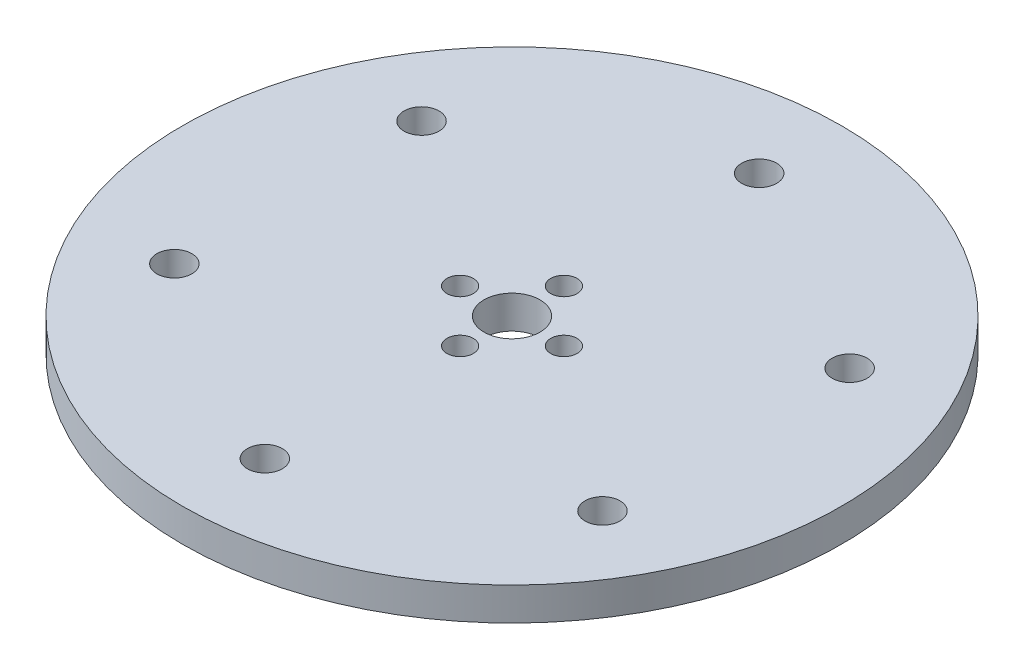
ISO-10303-21;
HEADER;
FILE_DESCRIPTION(('STEP AP214'),'2;1');
FILE_NAME('part.step','',(''),(''),'','','');
FILE_SCHEMA(('AUTOMOTIVE_DESIGN { 1 0 10303 214 1 1 1 1 }'));
ENDSEC;
DATA;
#1=APPLICATION_CONTEXT('core data for automotive mechanical design processes');
#2=APPLICATION_PROTOCOL_DEFINITION('international standard','automotive_design',2000,#1);
#3=PRODUCT_CONTEXT('',#1,'mechanical');
#4=PRODUCT('Part','Part','',(#3));
#5=PRODUCT_RELATED_PRODUCT_CATEGORY('part','',(#4));
#6=PRODUCT_DEFINITION_FORMATION('','',#4);
#7=PRODUCT_DEFINITION_CONTEXT('part definition',#1,'design');
#8=PRODUCT_DEFINITION('design','',#6,#7);
#9=PRODUCT_DEFINITION_SHAPE('','',#8);
#10=(LENGTH_UNIT() NAMED_UNIT(*) SI_UNIT(.MILLI.,.METRE.));
#11=(NAMED_UNIT(*) PLANE_ANGLE_UNIT() SI_UNIT($,.RADIAN.));
#12=(NAMED_UNIT(*) SI_UNIT($,.STERADIAN.) SOLID_ANGLE_UNIT());
#13=UNCERTAINTY_MEASURE_WITH_UNIT(LENGTH_MEASURE(1.E-05),#10,'distance_accuracy_value','');
#14=(GEOMETRIC_REPRESENTATION_CONTEXT(3) GLOBAL_UNCERTAINTY_ASSIGNED_CONTEXT((#13)) GLOBAL_UNIT_ASSIGNED_CONTEXT((#10,
#11,#12)) REPRESENTATION_CONTEXT('',''));
#15=CARTESIAN_POINT('',(0.,0.,0.));
#16=DIRECTION('',(0.,0.,1.));
#17=DIRECTION('',(1.,0.,0.));
#18=AXIS2_PLACEMENT_3D('',#15,#16,#17);
#19=CARTESIAN_POINT('',(0.,5.08,0.));
#20=DIRECTION('',(0.,-1.,0.));
#21=DIRECTION('',(0.,0.,-1.));
#22=AXIS2_PLACEMENT_3D('',#19,#20,#21);
#23=CYLINDRICAL_SURFACE('',#22,50.8);
#24=CARTESIAN_POINT('',(0.,5.08,0.));
#25=DIRECTION('',(0.,1.,0.));
#26=DIRECTION('',(0.,0.,1.));
#27=AXIS2_PLACEMENT_3D('',#24,#25,#26);
#28=CIRCLE('',#27,50.8);
#29=CARTESIAN_POINT('',(0.,5.08,50.8));
#30=VERTEX_POINT('',#29);
#31=EDGE_CURVE('E10',#30,#30,#28,.T.);
#32=ORIENTED_EDGE('',*,*,#31,.F.);
#33=EDGE_LOOP('',(#32));
#34=FACE_BOUND('',#33,.T.);
#35=CARTESIAN_POINT('',(0.,0.,0.));
#36=DIRECTION('',(0.,1.,0.));
#37=DIRECTION('',(0.,0.,1.));
#38=AXIS2_PLACEMENT_3D('',#35,#36,#37);
#39=CIRCLE('',#38,50.8);
#40=CARTESIAN_POINT('',(0.,0.,50.8));
#41=VERTEX_POINT('',#40);
#42=EDGE_CURVE('E38',#41,#41,#39,.T.);
#43=ORIENTED_EDGE('',*,*,#42,.T.);
#44=EDGE_LOOP('',(#43));
#45=FACE_BOUND('',#44,.T.);
#46=ADVANCED_FACE('F35',(#34,#45),#23,.T.);
#47=CARTESIAN_POINT('',(0.,5.08,0.));
#48=DIRECTION('',(0.,1.,0.));
#49=DIRECTION('',(0.,0.,1.));
#50=AXIS2_PLACEMENT_3D('',#47,#48,#49);
#51=PLANE('',#50);
#52=CARTESIAN_POINT('',(8.001,5.08,0.));
#53=DIRECTION('',(0.,-1.,0.));
#54=DIRECTION('',(0.,0.,-1.));
#55=AXIS2_PLACEMENT_3D('',#52,#53,#54);
#56=CIRCLE('',#55,2.032);
#57=CARTESIAN_POINT('',(8.001,5.08,-2.03200000000008));
#58=VERTEX_POINT('',#57);
#59=EDGE_CURVE('E104',#58,#58,#56,.T.);
#60=ORIENTED_EDGE('',*,*,#59,.T.);
#61=EDGE_LOOP('',(#60));
#62=FACE_BOUND('',#61,.T.);
#63=CARTESIAN_POINT('',(0.,5.08,8.001));
#64=DIRECTION('',(0.,-1.,0.));
#65=DIRECTION('',(0.,0.,-1.));
#66=AXIS2_PLACEMENT_3D('',#63,#64,#65);
#67=CIRCLE('',#66,2.032);
#68=CARTESIAN_POINT('',(0.,5.08,5.969));
#69=VERTEX_POINT('',#68);
#70=EDGE_CURVE('E98',#69,#69,#67,.T.);
#71=ORIENTED_EDGE('',*,*,#70,.T.);
#72=EDGE_LOOP('',(#71));
#73=FACE_BOUND('',#72,.T.);
#74=CARTESIAN_POINT('',(-8.001,5.08,0.));
#75=DIRECTION('',(0.,-1.,0.));
#76=DIRECTION('',(0.,0.,-1.));
#77=AXIS2_PLACEMENT_3D('',#74,#75,#76);
#78=CIRCLE('',#77,2.032);
#79=CARTESIAN_POINT('',(-8.001,5.08,-2.03199999999997));
#80=VERTEX_POINT('',#79);
#81=EDGE_CURVE('E92',#80,#80,#78,.T.);
#82=ORIENTED_EDGE('',*,*,#81,.T.);
#83=EDGE_LOOP('',(#82));
#84=FACE_BOUND('',#83,.T.);
#85=CARTESIAN_POINT('',(0.,5.08,-8.001));
#86=DIRECTION('',(0.,-1.,0.));
#87=DIRECTION('',(0.,0.,-1.));
#88=AXIS2_PLACEMENT_3D('',#85,#86,#87);
#89=CIRCLE('',#88,2.032);
#90=CARTESIAN_POINT('',(0.,5.08,-10.033));
#91=VERTEX_POINT('',#90);
#92=EDGE_CURVE('E86',#91,#91,#89,.T.);
#93=ORIENTED_EDGE('',*,*,#92,.T.);
#94=EDGE_LOOP('',(#93));
#95=FACE_BOUND('',#94,.T.);
#96=CARTESIAN_POINT('',(0.,5.08,0.));
#97=DIRECTION('',(0.,-1.,0.));
#98=DIRECTION('',(0.,0.,-1.));
#99=AXIS2_PLACEMENT_3D('',#96,#97,#98);
#100=CIRCLE('',#99,4.318);
#101=CARTESIAN_POINT('',(0.,5.08,-4.318));
#102=VERTEX_POINT('',#101);
#103=EDGE_CURVE('E80',#102,#102,#100,.T.);
#104=ORIENTED_EDGE('',*,*,#103,.T.);
#105=EDGE_LOOP('',(#104));
#106=FACE_BOUND('',#105,.T.);
#107=CARTESIAN_POINT('',(32.9955678841869,5.08,19.0500000000004));
#108=DIRECTION('',(0.,1.,0.));
#109=DIRECTION('',(0.,0.,1.));
#110=AXIS2_PLACEMENT_3D('',#107,#108,#109);
#111=CIRCLE('',#110,2.69875);
#112=CARTESIAN_POINT('',(32.9955678841869,5.08,21.7487500000004));
#113=VERTEX_POINT('',#112);
#114=EDGE_CURVE('E77',#113,#113,#111,.T.);
#115=ORIENTED_EDGE('',*,*,#114,.F.);
#116=EDGE_LOOP('',(#115));
#117=FACE_BOUND('',#116,.T.);
#118=CARTESIAN_POINT('',(32.9955678841873,5.08,-19.0499999999997));
#119=DIRECTION('',(0.,1.,0.));
#120=DIRECTION('',(0.,0.,1.));
#121=AXIS2_PLACEMENT_3D('',#118,#119,#120);
#122=CIRCLE('',#121,2.69875);
#123=CARTESIAN_POINT('',(32.9955678841873,5.08,-16.3512499999997));
#124=VERTEX_POINT('',#123);
#125=EDGE_CURVE('E71',#124,#124,#122,.T.);
#126=ORIENTED_EDGE('',*,*,#125,.F.);
#127=EDGE_LOOP('',(#126));
#128=FACE_BOUND('',#127,.T.);
#129=CARTESIAN_POINT('',(2.66050878019847E-13,5.08,-38.1));
#130=DIRECTION('',(0.,1.,0.));
#131=DIRECTION('',(0.,0.,1.));
#132=AXIS2_PLACEMENT_3D('',#129,#130,#131);
#133=CIRCLE('',#132,2.69875);
#134=CARTESIAN_POINT('',(2.66050878019847E-13,5.08,-35.40125));
#135=VERTEX_POINT('',#134);
#136=EDGE_CURVE('E65',#135,#135,#133,.T.);
#137=ORIENTED_EDGE('',*,*,#136,.F.);
#138=EDGE_LOOP('',(#137));
#139=FACE_BOUND('',#138,.T.);
#140=CARTESIAN_POINT('',(-32.995567884187,5.08,-19.0500000000002));
#141=DIRECTION('',(0.,1.,0.));
#142=DIRECTION('',(0.,0.,1.));
#143=AXIS2_PLACEMENT_3D('',#140,#141,#142);
#144=CIRCLE('',#143,2.69875);
#145=CARTESIAN_POINT('',(-32.995567884187,5.08,-16.3512500000002));
#146=VERTEX_POINT('',#145);
#147=EDGE_CURVE('E59',#146,#146,#144,.T.);
#148=ORIENTED_EDGE('',*,*,#147,.F.);
#149=EDGE_LOOP('',(#148));
#150=FACE_BOUND('',#149,.T.);
#151=CARTESIAN_POINT('',(-32.9955678841872,5.08,19.0499999999999));
#152=DIRECTION('',(0.,1.,0.));
#153=DIRECTION('',(0.,0.,1.));
#154=AXIS2_PLACEMENT_3D('',#151,#152,#153);
#155=CIRCLE('',#154,2.69875);
#156=CARTESIAN_POINT('',(-32.9955678841872,5.08,21.7487499999999));
#157=VERTEX_POINT('',#156);
#158=EDGE_CURVE('E53',#157,#157,#155,.T.);
#159=ORIENTED_EDGE('',*,*,#158,.F.);
#160=EDGE_LOOP('',(#159));
#161=FACE_BOUND('',#160,.T.);
#162=CARTESIAN_POINT('',(0.,5.08,38.1));
#163=DIRECTION('',(0.,1.,0.));
#164=DIRECTION('',(0.,0.,1.));
#165=AXIS2_PLACEMENT_3D('',#162,#163,#164);
#166=CIRCLE('',#165,2.69875);
#167=CARTESIAN_POINT('',(0.,5.08,40.79875));
#168=VERTEX_POINT('',#167);
#169=EDGE_CURVE('E47',#168,#168,#166,.T.);
#170=ORIENTED_EDGE('',*,*,#169,.F.);
#171=EDGE_LOOP('',(#170));
#172=FACE_BOUND('',#171,.T.);
#173=ORIENTED_EDGE('',*,*,#31,.T.);
#174=EDGE_LOOP('',(#173));
#175=FACE_BOUND('',#174,.T.);
#176=ADVANCED_FACE('F113',(#62,#73,#84,#95,#106,#117,#128,#139,#150,#161,#172,#175),#51,.T.);
#177=CARTESIAN_POINT('',(0.,0.,0.));
#178=DIRECTION('',(0.,1.,0.));
#179=DIRECTION('',(0.,0.,1.));
#180=AXIS2_PLACEMENT_3D('',#177,#178,#179);
#181=PLANE('',#180);
#182=CARTESIAN_POINT('',(8.001,0.,0.));
#183=DIRECTION('',(0.,-1.,0.));
#184=DIRECTION('',(0.,0.,-1.));
#185=AXIS2_PLACEMENT_3D('',#182,#183,#184);
#186=CIRCLE('',#185,2.032);
#187=CARTESIAN_POINT('',(8.001,0.,-2.03200000000008));
#188=VERTEX_POINT('',#187);
#189=EDGE_CURVE('E107',#188,#188,#186,.T.);
#190=ORIENTED_EDGE('',*,*,#189,.F.);
#191=EDGE_LOOP('',(#190));
#192=FACE_BOUND('',#191,.T.);
#193=CARTESIAN_POINT('',(0.,0.,8.001));
#194=DIRECTION('',(0.,-1.,0.));
#195=DIRECTION('',(0.,0.,-1.));
#196=AXIS2_PLACEMENT_3D('',#193,#194,#195);
#197=CIRCLE('',#196,2.032);
#198=CARTESIAN_POINT('',(0.,0.,5.969));
#199=VERTEX_POINT('',#198);
#200=EDGE_CURVE('E101',#199,#199,#197,.T.);
#201=ORIENTED_EDGE('',*,*,#200,.F.);
#202=EDGE_LOOP('',(#201));
#203=FACE_BOUND('',#202,.T.);
#204=CARTESIAN_POINT('',(-8.001,0.,0.));
#205=DIRECTION('',(0.,-1.,0.));
#206=DIRECTION('',(0.,0.,-1.));
#207=AXIS2_PLACEMENT_3D('',#204,#205,#206);
#208=CIRCLE('',#207,2.032);
#209=CARTESIAN_POINT('',(-8.001,0.,-2.03199999999997));
#210=VERTEX_POINT('',#209);
#211=EDGE_CURVE('E95',#210,#210,#208,.T.);
#212=ORIENTED_EDGE('',*,*,#211,.F.);
#213=EDGE_LOOP('',(#212));
#214=FACE_BOUND('',#213,.T.);
#215=CARTESIAN_POINT('',(0.,0.,-8.001));
#216=DIRECTION('',(0.,-1.,0.));
#217=DIRECTION('',(0.,0.,-1.));
#218=AXIS2_PLACEMENT_3D('',#215,#216,#217);
#219=CIRCLE('',#218,2.032);
#220=CARTESIAN_POINT('',(0.,0.,-10.033));
#221=VERTEX_POINT('',#220);
#222=EDGE_CURVE('E89',#221,#221,#219,.T.);
#223=ORIENTED_EDGE('',*,*,#222,.F.);
#224=EDGE_LOOP('',(#223));
#225=FACE_BOUND('',#224,.T.);
#226=CARTESIAN_POINT('',(0.,0.,0.));
#227=DIRECTION('',(0.,-1.,0.));
#228=DIRECTION('',(0.,0.,-1.));
#229=AXIS2_PLACEMENT_3D('',#226,#227,#228);
#230=CIRCLE('',#229,4.318);
#231=CARTESIAN_POINT('',(0.,0.,-4.318));
#232=VERTEX_POINT('',#231);
#233=EDGE_CURVE('E83',#232,#232,#230,.T.);
#234=ORIENTED_EDGE('',*,*,#233,.F.);
#235=EDGE_LOOP('',(#234));
#236=FACE_BOUND('',#235,.T.);
#237=CARTESIAN_POINT('',(32.9955678841869,0.,19.0500000000004));
#238=DIRECTION('',(0.,1.,0.));
#239=DIRECTION('',(0.,0.,1.));
#240=AXIS2_PLACEMENT_3D('',#237,#238,#239);
#241=CIRCLE('',#240,2.69875);
#242=CARTESIAN_POINT('',(32.9955678841869,0.,21.7487500000004));
#243=VERTEX_POINT('',#242);
#244=EDGE_CURVE('E74',#243,#243,#241,.T.);
#245=ORIENTED_EDGE('',*,*,#244,.T.);
#246=EDGE_LOOP('',(#245));
#247=FACE_BOUND('',#246,.T.);
#248=CARTESIAN_POINT('',(32.9955678841873,0.,-19.0499999999997));
#249=DIRECTION('',(0.,1.,0.));
#250=DIRECTION('',(0.,0.,1.));
#251=AXIS2_PLACEMENT_3D('',#248,#249,#250);
#252=CIRCLE('',#251,2.69875);
#253=CARTESIAN_POINT('',(32.9955678841873,0.,-16.3512499999997));
#254=VERTEX_POINT('',#253);
#255=EDGE_CURVE('E68',#254,#254,#252,.T.);
#256=ORIENTED_EDGE('',*,*,#255,.T.);
#257=EDGE_LOOP('',(#256));
#258=FACE_BOUND('',#257,.T.);
#259=CARTESIAN_POINT('',(2.66050878019847E-13,0.,-38.1));
#260=DIRECTION('',(0.,1.,0.));
#261=DIRECTION('',(0.,0.,1.));
#262=AXIS2_PLACEMENT_3D('',#259,#260,#261);
#263=CIRCLE('',#262,2.69875);
#264=CARTESIAN_POINT('',(2.66050878019847E-13,0.,-35.40125));
#265=VERTEX_POINT('',#264);
#266=EDGE_CURVE('E62',#265,#265,#263,.T.);
#267=ORIENTED_EDGE('',*,*,#266,.T.);
#268=EDGE_LOOP('',(#267));
#269=FACE_BOUND('',#268,.T.);
#270=CARTESIAN_POINT('',(-32.995567884187,0.,-19.0500000000002));
#271=DIRECTION('',(0.,1.,0.));
#272=DIRECTION('',(0.,0.,1.));
#273=AXIS2_PLACEMENT_3D('',#270,#271,#272);
#274=CIRCLE('',#273,2.69875);
#275=CARTESIAN_POINT('',(-32.995567884187,0.,-16.3512500000002));
#276=VERTEX_POINT('',#275);
#277=EDGE_CURVE('E56',#276,#276,#274,.T.);
#278=ORIENTED_EDGE('',*,*,#277,.T.);
#279=EDGE_LOOP('',(#278));
#280=FACE_BOUND('',#279,.T.);
#281=CARTESIAN_POINT('',(-32.9955678841872,0.,19.0499999999999));
#282=DIRECTION('',(0.,1.,0.));
#283=DIRECTION('',(0.,0.,1.));
#284=AXIS2_PLACEMENT_3D('',#281,#282,#283);
#285=CIRCLE('',#284,2.69875);
#286=CARTESIAN_POINT('',(-32.9955678841872,0.,21.7487499999999));
#287=VERTEX_POINT('',#286);
#288=EDGE_CURVE('E50',#287,#287,#285,.T.);
#289=ORIENTED_EDGE('',*,*,#288,.T.);
#290=EDGE_LOOP('',(#289));
#291=FACE_BOUND('',#290,.T.);
#292=CARTESIAN_POINT('',(0.,0.,38.1));
#293=DIRECTION('',(0.,1.,0.));
#294=DIRECTION('',(0.,0.,1.));
#295=AXIS2_PLACEMENT_3D('',#292,#293,#294);
#296=CIRCLE('',#295,2.69875);
#297=CARTESIAN_POINT('',(0.,0.,40.79875));
#298=VERTEX_POINT('',#297);
#299=EDGE_CURVE('E45',#298,#298,#296,.T.);
#300=ORIENTED_EDGE('',*,*,#299,.T.);
#301=EDGE_LOOP('',(#300));
#302=FACE_BOUND('',#301,.T.);
#303=ORIENTED_EDGE('',*,*,#42,.F.);
#304=EDGE_LOOP('',(#303));
#305=FACE_BOUND('',#304,.T.);
#306=ADVANCED_FACE('F123',(#192,#203,#214,#225,#236,#247,#258,#269,#280,#291,#302,#305),#181,.F.);
#307=CARTESIAN_POINT('',(0.,0.,38.1));
#308=DIRECTION('',(0.,1.,0.));
#309=DIRECTION('',(0.,0.,1.));
#310=AXIS2_PLACEMENT_3D('',#307,#308,#309);
#311=CYLINDRICAL_SURFACE('',#310,2.69875);
#312=ORIENTED_EDGE('',*,*,#299,.F.);
#313=EDGE_LOOP('',(#312));
#314=FACE_BOUND('',#313,.T.);
#315=ORIENTED_EDGE('',*,*,#169,.T.);
#316=EDGE_LOOP('',(#315));
#317=FACE_BOUND('',#316,.T.);
#318=ADVANCED_FACE('F126',(#314,#317),#311,.F.);
#319=CARTESIAN_POINT('',(-32.9955678841872,0.,19.0499999999999));
#320=DIRECTION('',(0.,1.,0.));
#321=DIRECTION('',(0.,0.,1.));
#322=AXIS2_PLACEMENT_3D('',#319,#320,#321);
#323=CYLINDRICAL_SURFACE('',#322,2.69875);
#324=ORIENTED_EDGE('',*,*,#288,.F.);
#325=EDGE_LOOP('',(#324));
#326=FACE_BOUND('',#325,.T.);
#327=ORIENTED_EDGE('',*,*,#158,.T.);
#328=EDGE_LOOP('',(#327));
#329=FACE_BOUND('',#328,.T.);
#330=ADVANCED_FACE('F160',(#326,#329),#323,.F.);
#331=CARTESIAN_POINT('',(-32.995567884187,0.,-19.0500000000002));
#332=DIRECTION('',(0.,1.,0.));
#333=DIRECTION('',(0.,0.,1.));
#334=AXIS2_PLACEMENT_3D('',#331,#332,#333);
#335=CYLINDRICAL_SURFACE('',#334,2.69875);
#336=ORIENTED_EDGE('',*,*,#277,.F.);
#337=EDGE_LOOP('',(#336));
#338=FACE_BOUND('',#337,.T.);
#339=ORIENTED_EDGE('',*,*,#147,.T.);
#340=EDGE_LOOP('',(#339));
#341=FACE_BOUND('',#340,.T.);
#342=ADVANCED_FACE('F164',(#338,#341),#335,.F.);
#343=CARTESIAN_POINT('',(2.66050878019847E-13,0.,-38.1));
#344=DIRECTION('',(0.,1.,0.));
#345=DIRECTION('',(0.,0.,1.));
#346=AXIS2_PLACEMENT_3D('',#343,#344,#345);
#347=CYLINDRICAL_SURFACE('',#346,2.69875);
#348=ORIENTED_EDGE('',*,*,#266,.F.);
#349=EDGE_LOOP('',(#348));
#350=FACE_BOUND('',#349,.T.);
#351=ORIENTED_EDGE('',*,*,#136,.T.);
#352=EDGE_LOOP('',(#351));
#353=FACE_BOUND('',#352,.T.);
#354=ADVANCED_FACE('F168',(#350,#353),#347,.F.);
#355=CARTESIAN_POINT('',(32.9955678841873,0.,-19.0499999999997));
#356=DIRECTION('',(0.,1.,0.));
#357=DIRECTION('',(0.,0.,1.));
#358=AXIS2_PLACEMENT_3D('',#355,#356,#357);
#359=CYLINDRICAL_SURFACE('',#358,2.69875);
#360=ORIENTED_EDGE('',*,*,#255,.F.);
#361=EDGE_LOOP('',(#360));
#362=FACE_BOUND('',#361,.T.);
#363=ORIENTED_EDGE('',*,*,#125,.T.);
#364=EDGE_LOOP('',(#363));
#365=FACE_BOUND('',#364,.T.);
#366=ADVANCED_FACE('F172',(#362,#365),#359,.F.);
#367=CARTESIAN_POINT('',(32.9955678841869,0.,19.0500000000004));
#368=DIRECTION('',(0.,1.,0.));
#369=DIRECTION('',(0.,0.,1.));
#370=AXIS2_PLACEMENT_3D('',#367,#368,#369);
#371=CYLINDRICAL_SURFACE('',#370,2.69875);
#372=ORIENTED_EDGE('',*,*,#244,.F.);
#373=EDGE_LOOP('',(#372));
#374=FACE_BOUND('',#373,.T.);
#375=ORIENTED_EDGE('',*,*,#114,.T.);
#376=EDGE_LOOP('',(#375));
#377=FACE_BOUND('',#376,.T.);
#378=ADVANCED_FACE('F176',(#374,#377),#371,.F.);
#379=CARTESIAN_POINT('',(0.,5.08,0.));
#380=DIRECTION('',(0.,-1.,0.));
#381=DIRECTION('',(0.,0.,-1.));
#382=AXIS2_PLACEMENT_3D('',#379,#380,#381);
#383=CYLINDRICAL_SURFACE('',#382,4.318);
#384=ORIENTED_EDGE('',*,*,#103,.F.);
#385=EDGE_LOOP('',(#384));
#386=FACE_BOUND('',#385,.T.);
#387=ORIENTED_EDGE('',*,*,#233,.T.);
#388=EDGE_LOOP('',(#387));
#389=FACE_BOUND('',#388,.T.);
#390=ADVANCED_FACE('F180',(#386,#389),#383,.F.);
#391=CARTESIAN_POINT('',(0.,5.08,-8.001));
#392=DIRECTION('',(0.,-1.,0.));
#393=DIRECTION('',(0.,0.,-1.));
#394=AXIS2_PLACEMENT_3D('',#391,#392,#393);
#395=CYLINDRICAL_SURFACE('',#394,2.032);
#396=ORIENTED_EDGE('',*,*,#92,.F.);
#397=EDGE_LOOP('',(#396));
#398=FACE_BOUND('',#397,.T.);
#399=ORIENTED_EDGE('',*,*,#222,.T.);
#400=EDGE_LOOP('',(#399));
#401=FACE_BOUND('',#400,.T.);
#402=ADVANCED_FACE('F184',(#398,#401),#395,.F.);
#403=CARTESIAN_POINT('',(-8.001,5.08,0.));
#404=DIRECTION('',(0.,-1.,0.));
#405=DIRECTION('',(0.,0.,-1.));
#406=AXIS2_PLACEMENT_3D('',#403,#404,#405);
#407=CYLINDRICAL_SURFACE('',#406,2.032);
#408=ORIENTED_EDGE('',*,*,#81,.F.);
#409=EDGE_LOOP('',(#408));
#410=FACE_BOUND('',#409,.T.);
#411=ORIENTED_EDGE('',*,*,#211,.T.);
#412=EDGE_LOOP('',(#411));
#413=FACE_BOUND('',#412,.T.);
#414=ADVANCED_FACE('F188',(#410,#413),#407,.F.);
#415=CARTESIAN_POINT('',(0.,5.08,8.001));
#416=DIRECTION('',(0.,-1.,0.));
#417=DIRECTION('',(0.,0.,-1.));
#418=AXIS2_PLACEMENT_3D('',#415,#416,#417);
#419=CYLINDRICAL_SURFACE('',#418,2.032);
#420=ORIENTED_EDGE('',*,*,#70,.F.);
#421=EDGE_LOOP('',(#420));
#422=FACE_BOUND('',#421,.T.);
#423=ORIENTED_EDGE('',*,*,#200,.T.);
#424=EDGE_LOOP('',(#423));
#425=FACE_BOUND('',#424,.T.);
#426=ADVANCED_FACE('F119',(#422,#425),#419,.F.);
#427=CARTESIAN_POINT('',(8.001,5.08,0.));
#428=DIRECTION('',(0.,-1.,0.));
#429=DIRECTION('',(0.,0.,-1.));
#430=AXIS2_PLACEMENT_3D('',#427,#428,#429);
#431=CYLINDRICAL_SURFACE('',#430,2.032);
#432=ORIENTED_EDGE('',*,*,#59,.F.);
#433=EDGE_LOOP('',(#432));
#434=FACE_BOUND('',#433,.T.);
#435=ORIENTED_EDGE('',*,*,#189,.T.);
#436=EDGE_LOOP('',(#435));
#437=FACE_BOUND('',#436,.T.);
#438=ADVANCED_FACE('F116',(#434,#437),#431,.F.);
#439=CLOSED_SHELL('',(#46,#176,#306,#318,#330,#342,#354,#366,#378,#390,#402,#414,#426,#438));
#440=MANIFOLD_SOLID_BREP('B2',#439);
#441=ADVANCED_BREP_SHAPE_REPRESENTATION('',(#18,#440),#14);
#442=SHAPE_DEFINITION_REPRESENTATION(#9,#441);
ENDSEC;
END-ISO-10303-21;
